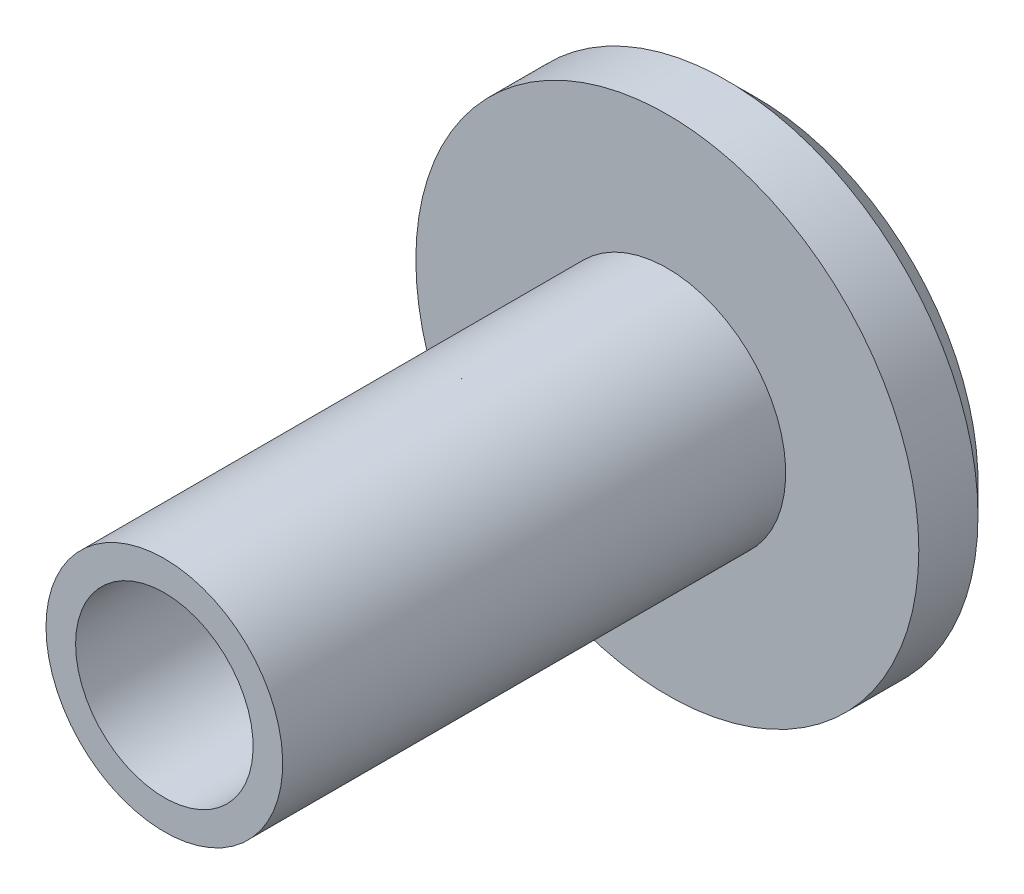
ISO-10303-21;
HEADER;
FILE_DESCRIPTION(('STEP AP214'),'2;1');
FILE_NAME('part.step','',(''),(''),'','','');
FILE_SCHEMA(('AUTOMOTIVE_DESIGN { 1 0 10303 214 1 1 1 1 }'));
ENDSEC;
DATA;
#1=APPLICATION_CONTEXT('core data for automotive mechanical design processes');
#2=APPLICATION_PROTOCOL_DEFINITION('international standard','automotive_design',2000,#1);
#3=PRODUCT_CONTEXT('',#1,'mechanical');
#4=PRODUCT('Part','Part','',(#3));
#5=PRODUCT_RELATED_PRODUCT_CATEGORY('part','',(#4));
#6=PRODUCT_DEFINITION_FORMATION('','',#4);
#7=PRODUCT_DEFINITION_CONTEXT('part definition',#1,'design');
#8=PRODUCT_DEFINITION('design','',#6,#7);
#9=PRODUCT_DEFINITION_SHAPE('','',#8);
#10=(LENGTH_UNIT() NAMED_UNIT(*) SI_UNIT(.MILLI.,.METRE.));
#11=(NAMED_UNIT(*) PLANE_ANGLE_UNIT() SI_UNIT($,.RADIAN.));
#12=(NAMED_UNIT(*) SI_UNIT($,.STERADIAN.) SOLID_ANGLE_UNIT());
#13=UNCERTAINTY_MEASURE_WITH_UNIT(LENGTH_MEASURE(1.E-05),#10,'distance_accuracy_value','');
#14=(GEOMETRIC_REPRESENTATION_CONTEXT(3) GLOBAL_UNCERTAINTY_ASSIGNED_CONTEXT((#13)) GLOBAL_UNIT_ASSIGNED_CONTEXT((#10,
#11,#12)) REPRESENTATION_CONTEXT('',''));
#15=CARTESIAN_POINT('',(0.,0.,0.));
#16=DIRECTION('',(0.,0.,1.));
#17=DIRECTION('',(1.,0.,0.));
#18=AXIS2_PLACEMENT_3D('',#15,#16,#17);
#19=CARTESIAN_POINT('',(172.530839914594,-193.837695743439,102.260489149574));
#20=DIRECTION('',(0.,0.,1.));
#21=DIRECTION('',(1.,0.,0.));
#22=AXIS2_PLACEMENT_3D('',#19,#20,#21);
#23=CONICAL_SURFACE('',#22,3.75,0.785398162499995);
#24=CARTESIAN_POINT('',(172.530839914594,-193.837695743439,102.260489149574));
#25=DIRECTION('',(0.,0.,-1.));
#26=DIRECTION('',(-1.,0.,0.));
#27=AXIS2_PLACEMENT_3D('',#24,#25,#26);
#28=CIRCLE('',#27,3.75);
#29=CARTESIAN_POINT('',(168.780839914594,-193.837695743439,102.260489149574));
#30=VERTEX_POINT('',#29);
#31=EDGE_CURVE('E216',#30,#30,#28,.T.);
#32=ORIENTED_EDGE('',*,*,#31,.F.);
#33=EDGE_LOOP('',(#32));
#34=FACE_BOUND('',#33,.T.);
#35=CARTESIAN_POINT('',(172.530839914594,-193.837695743439,102.760489149574));
#36=DIRECTION('',(0.,0.,1.));
#37=DIRECTION('',(-1.,0.,0.));
#38=AXIS2_PLACEMENT_3D('',#35,#36,#37);
#39=CIRCLE('',#38,4.25);
#40=CARTESIAN_POINT('',(168.280839914593,-193.837695743439,102.760489149574));
#41=VERTEX_POINT('',#40);
#42=EDGE_CURVE('E46',#41,#41,#39,.T.);
#43=ORIENTED_EDGE('',*,*,#42,.F.);
#44=EDGE_LOOP('',(#43));
#45=FACE_BOUND('',#44,.T.);
#46=ADVANCED_FACE('F42',(#34,#45),#23,.T.);
#47=CARTESIAN_POINT('',(172.530839914594,-193.837695743439,103.760489149574));
#48=DIRECTION('',(0.,0.,-1.));
#49=DIRECTION('',(-1.,0.,0.));
#50=AXIS2_PLACEMENT_3D('',#47,#48,#49);
#51=PLANE('',#50);
#52=CARTESIAN_POINT('',(172.530839914594,-193.837695743439,103.760489149574));
#53=DIRECTION('',(0.,0.,-1.));
#54=DIRECTION('',(0.,1.,0.));
#55=AXIS2_PLACEMENT_3D('',#52,#53,#54);
#56=CIRCLE('',#55,1.5);
#57=CARTESIAN_POINT('',(172.530839914594,-192.337695743439,103.760489149574));
#58=VERTEX_POINT('',#57);
#59=EDGE_CURVE('E107',#58,#58,#56,.T.);
#60=ORIENTED_EDGE('',*,*,#59,.F.);
#61=EDGE_LOOP('',(#60));
#62=FACE_BOUND('',#61,.T.);
#63=ADVANCED_FACE('F245',(#62),#51,.F.);
#64=CARTESIAN_POINT('',(172.530839914594,-193.837695743439,103.260489149574));
#65=DIRECTION('',(0.,0.,-1.));
#66=DIRECTION('',(-1.,0.,0.));
#67=AXIS2_PLACEMENT_3D('',#64,#65,#66);
#68=PLANE('',#67);
#69=DIRECTION('',(-0.866025403784439,-0.5,0.));
#70=VECTOR('',#69,1.);
#71=CARTESIAN_POINT('',(172.530839914594,-195.281071416414,103.260489149574));
#72=LINE('',#71,#70);
#73=CARTESIAN_POINT('',(173.780839914594,-194.559383579927,103.260489149574));
#74=VERTEX_POINT('',#73);
#75=CARTESIAN_POINT('',(172.530839914594,-195.281071416414,103.260489149574));
#76=VERTEX_POINT('',#75);
#77=EDGE_CURVE('E53',#74,#76,#72,.T.);
#78=ORIENTED_EDGE('',*,*,#77,.T.);
#79=DIRECTION('',(-0.866025403784438,0.5,0.));
#80=VECTOR('',#79,1.);
#81=CARTESIAN_POINT('',(171.280839914594,-194.559383579927,103.260489149574));
#82=LINE('',#81,#80);
#83=CARTESIAN_POINT('',(171.280839914594,-194.559383579927,103.260489149574));
#84=VERTEX_POINT('',#83);
#85=EDGE_CURVE('E11',#76,#84,#82,.T.);
#86=ORIENTED_EDGE('',*,*,#85,.T.);
#87=DIRECTION('',(0.,-1.,0.));
#88=VECTOR('',#87,1.);
#89=CARTESIAN_POINT('',(171.280839914594,-193.116007906952,103.260489149574));
#90=LINE('',#89,#88);
#91=CARTESIAN_POINT('',(171.280839914594,-193.116007906952,103.260489149574));
#92=VERTEX_POINT('',#91);
#93=EDGE_CURVE('E220',#92,#84,#90,.T.);
#94=ORIENTED_EDGE('',*,*,#93,.F.);
#95=DIRECTION('',(0.866025403784439,0.5,0.));
#96=VECTOR('',#95,1.);
#97=CARTESIAN_POINT('',(172.530839914594,-192.394320070465,103.260489149574));
#98=LINE('',#97,#96);
#99=CARTESIAN_POINT('',(172.530839914594,-192.394320070465,103.260489149574));
#100=VERTEX_POINT('',#99);
#101=EDGE_CURVE('E159',#92,#100,#98,.T.);
#102=ORIENTED_EDGE('',*,*,#101,.T.);
#103=DIRECTION('',(-0.866025403784439,0.5,0.));
#104=VECTOR('',#103,1.);
#105=CARTESIAN_POINT('',(173.780839914594,-193.116007906952,103.260489149574));
#106=LINE('',#105,#104);
#107=CARTESIAN_POINT('',(173.780839914594,-193.116007906952,103.260489149574));
#108=VERTEX_POINT('',#107);
#109=EDGE_CURVE('E156',#108,#100,#106,.T.);
#110=ORIENTED_EDGE('',*,*,#109,.F.);
#111=DIRECTION('',(0.,-1.,0.));
#112=VECTOR('',#111,1.);
#113=CARTESIAN_POINT('',(173.780839914594,-194.559383579927,103.260489149574));
#114=LINE('',#113,#112);
#115=EDGE_CURVE('E143',#108,#74,#114,.T.);
#116=ORIENTED_EDGE('',*,*,#115,.T.);
#117=EDGE_LOOP('',(#78,#86,#94,#102,#110,#116));
#118=FACE_BOUND('',#117,.T.);
#119=ADVANCED_FACE('F157',(#118),#68,.T.);
#120=CARTESIAN_POINT('',(171.280839914594,-194.559383579927,117.460489149574));
#121=DIRECTION('',(0.5,0.866025403784438,0.));
#122=DIRECTION('',(0.,0.,-1.));
#123=AXIS2_PLACEMENT_3D('',#120,#121,#122);
#124=PLANE('',#123);
#125=DIRECTION('',(0.,0.,1.));
#126=VECTOR('',#125,1.);
#127=CARTESIAN_POINT('',(171.280839914594,-194.559383579927,117.460489149574));
#128=LINE('',#127,#126);
#129=CARTESIAN_POINT('',(171.280839914594,-194.559383579927,102.260489149574));
#130=VERTEX_POINT('',#129);
#131=EDGE_CURVE('E178',#130,#84,#128,.T.);
#132=ORIENTED_EDGE('',*,*,#131,.T.);
#133=ORIENTED_EDGE('',*,*,#85,.F.);
#134=DIRECTION('',(0.,0.,1.));
#135=VECTOR('',#134,1.);
#136=CARTESIAN_POINT('',(172.530839914594,-195.281071416414,117.460489149574));
#137=LINE('',#136,#135);
#138=CARTESIAN_POINT('',(172.530839914594,-195.281071416414,102.260489149574));
#139=VERTEX_POINT('',#138);
#140=EDGE_CURVE('E153',#139,#76,#137,.T.);
#141=ORIENTED_EDGE('',*,*,#140,.F.);
#142=DIRECTION('',(0.866025403784438,-0.5,0.));
#143=VECTOR('',#142,1.);
#144=CARTESIAN_POINT('',(171.905839914593,-194.92022749817,102.260489149574));
#145=LINE('',#144,#143);
#146=EDGE_CURVE('E207',#130,#139,#145,.T.);
#147=ORIENTED_EDGE('',*,*,#146,.F.);
#148=EDGE_LOOP('',(#132,#133,#141,#147));
#149=FACE_BOUND('',#148,.T.);
#150=ADVANCED_FACE('F280',(#149),#124,.T.);
#151=CARTESIAN_POINT('',(172.530839914594,-195.281071416414,117.460489149574));
#152=DIRECTION('',(-0.5,0.866025403784439,0.));
#153=DIRECTION('',(0.,0.,1.));
#154=AXIS2_PLACEMENT_3D('',#151,#152,#153);
#155=PLANE('',#154);
#156=ORIENTED_EDGE('',*,*,#140,.T.);
#157=ORIENTED_EDGE('',*,*,#77,.F.);
#158=DIRECTION('',(0.,0.,1.));
#159=VECTOR('',#158,1.);
#160=CARTESIAN_POINT('',(173.780839914594,-194.559383579927,117.460489149574));
#161=LINE('',#160,#159);
#162=CARTESIAN_POINT('',(173.780839914594,-194.559383579927,102.260489149574));
#163=VERTEX_POINT('',#162);
#164=EDGE_CURVE('E150',#163,#74,#161,.T.);
#165=ORIENTED_EDGE('',*,*,#164,.F.);
#166=DIRECTION('',(0.866025403784439,0.5,0.));
#167=VECTOR('',#166,1.);
#168=CARTESIAN_POINT('',(173.155839914593,-194.92022749817,102.260489149574));
#169=LINE('',#168,#167);
#170=EDGE_CURVE('E211',#139,#163,#169,.T.);
#171=ORIENTED_EDGE('',*,*,#170,.F.);
#172=EDGE_LOOP('',(#156,#157,#165,#171));
#173=FACE_BOUND('',#172,.T.);
#174=ADVANCED_FACE('F44',(#173),#155,.T.);
#175=CARTESIAN_POINT('',(173.780839914594,-194.559383579927,117.460489149574));
#176=DIRECTION('',(-1.,0.,0.));
#177=DIRECTION('',(0.,0.,1.));
#178=AXIS2_PLACEMENT_3D('',#175,#176,#177);
#179=PLANE('',#178);
#180=ORIENTED_EDGE('',*,*,#164,.T.);
#181=ORIENTED_EDGE('',*,*,#115,.F.);
#182=DIRECTION('',(0.,0.,1.));
#183=VECTOR('',#182,1.);
#184=CARTESIAN_POINT('',(173.780839914594,-193.116007906952,117.460489149574));
#185=LINE('',#184,#183);
#186=CARTESIAN_POINT('',(173.780839914594,-193.116007906952,102.260489149574));
#187=VERTEX_POINT('',#186);
#188=EDGE_CURVE('E148',#187,#108,#185,.T.);
#189=ORIENTED_EDGE('',*,*,#188,.F.);
#190=DIRECTION('',(0.,1.,0.));
#191=VECTOR('',#190,1.);
#192=CARTESIAN_POINT('',(173.780839914594,-193.837695743439,102.260489149574));
#193=LINE('',#192,#191);
#194=EDGE_CURVE('E181',#163,#187,#193,.T.);
#195=ORIENTED_EDGE('',*,*,#194,.F.);
#196=EDGE_LOOP('',(#180,#181,#189,#195));
#197=FACE_BOUND('',#196,.T.);
#198=ADVANCED_FACE('F145',(#197),#179,.T.);
#199=CARTESIAN_POINT('',(173.780839914594,-193.116007906952,117.460489149574));
#200=DIRECTION('',(-0.5,-0.866025403784439,0.));
#201=DIRECTION('',(-0.866025403784439,0.5,0.));
#202=AXIS2_PLACEMENT_3D('',#199,#200,#201);
#203=PLANE('',#202);
#204=ORIENTED_EDGE('',*,*,#188,.T.);
#205=ORIENTED_EDGE('',*,*,#109,.T.);
#206=DIRECTION('',(0.,0.,1.));
#207=VECTOR('',#206,1.);
#208=CARTESIAN_POINT('',(172.530839914594,-192.394320070465,117.460489149574));
#209=LINE('',#208,#207);
#210=CARTESIAN_POINT('',(172.530839914594,-192.394320070465,102.260489149574));
#211=VERTEX_POINT('',#210);
#212=EDGE_CURVE('E174',#211,#100,#209,.T.);
#213=ORIENTED_EDGE('',*,*,#212,.F.);
#214=DIRECTION('',(-0.866025403784439,0.5,0.));
#215=VECTOR('',#214,1.);
#216=CARTESIAN_POINT('',(173.155839914593,-192.755163988709,102.260489149574));
#217=LINE('',#216,#215);
#218=EDGE_CURVE('E166',#187,#211,#217,.T.);
#219=ORIENTED_EDGE('',*,*,#218,.F.);
#220=EDGE_LOOP('',(#204,#205,#213,#219));
#221=FACE_BOUND('',#220,.T.);
#222=ADVANCED_FACE('F164',(#221),#203,.T.);
#223=CARTESIAN_POINT('',(172.530839914594,-192.394320070465,117.460489149574));
#224=DIRECTION('',(0.5,-0.866025403784439,0.));
#225=DIRECTION('',(0.,0.,-1.));
#226=AXIS2_PLACEMENT_3D('',#223,#224,#225);
#227=PLANE('',#226);
#228=ORIENTED_EDGE('',*,*,#212,.T.);
#229=ORIENTED_EDGE('',*,*,#101,.F.);
#230=DIRECTION('',(0.,0.,1.));
#231=VECTOR('',#230,1.);
#232=CARTESIAN_POINT('',(171.280839914594,-193.116007906952,117.460489149574));
#233=LINE('',#232,#231);
#234=CARTESIAN_POINT('',(171.280839914594,-193.116007906952,102.260489149574));
#235=VERTEX_POINT('',#234);
#236=EDGE_CURVE('E184',#235,#92,#233,.T.);
#237=ORIENTED_EDGE('',*,*,#236,.F.);
#238=DIRECTION('',(-0.866025403784439,-0.5,0.));
#239=VECTOR('',#238,1.);
#240=CARTESIAN_POINT('',(171.905839914593,-192.755163988709,102.260489149574));
#241=LINE('',#240,#239);
#242=EDGE_CURVE('E208',#211,#235,#241,.T.);
#243=ORIENTED_EDGE('',*,*,#242,.F.);
#244=EDGE_LOOP('',(#228,#229,#237,#243));
#245=FACE_BOUND('',#244,.T.);
#246=ADVANCED_FACE('F271',(#245),#227,.T.);
#247=CARTESIAN_POINT('',(171.280839914594,-193.116007906952,117.460489149574));
#248=DIRECTION('',(1.,0.,0.));
#249=DIRECTION('',(0.,1.,0.));
#250=AXIS2_PLACEMENT_3D('',#247,#248,#249);
#251=PLANE('',#250);
#252=ORIENTED_EDGE('',*,*,#236,.T.);
#253=ORIENTED_EDGE('',*,*,#93,.T.);
#254=ORIENTED_EDGE('',*,*,#131,.F.);
#255=DIRECTION('',(0.,-1.,0.));
#256=VECTOR('',#255,1.);
#257=CARTESIAN_POINT('',(171.280839914594,-193.837695743439,102.260489149574));
#258=LINE('',#257,#256);
#259=EDGE_CURVE('E204',#235,#130,#258,.T.);
#260=ORIENTED_EDGE('',*,*,#259,.F.);
#261=EDGE_LOOP('',(#252,#253,#254,#260));
#262=FACE_BOUND('',#261,.T.);
#263=ADVANCED_FACE('F266',(#262),#251,.T.);
#264=CARTESIAN_POINT('',(172.530839914594,-193.837695743439,103.760489149574));
#265=DIRECTION('',(0.,0.,-1.));
#266=DIRECTION('',(-1.,0.,0.));
#267=AXIS2_PLACEMENT_3D('',#264,#265,#266);
#268=PLANE('',#267);
#269=CARTESIAN_POINT('',(172.530839914594,-193.837695743439,103.760489149574));
#270=DIRECTION('',(0.,0.,-1.));
#271=DIRECTION('',(-1.,0.,0.));
#272=AXIS2_PLACEMENT_3D('',#269,#270,#271);
#273=CIRCLE('',#272,4.25);
#274=CARTESIAN_POINT('',(168.280839914593,-193.837695743439,103.760489149574));
#275=VERTEX_POINT('',#274);
#276=EDGE_CURVE('E122',#275,#275,#273,.T.);
#277=ORIENTED_EDGE('',*,*,#276,.F.);
#278=EDGE_LOOP('',(#277));
#279=FACE_BOUND('',#278,.T.);
#280=CARTESIAN_POINT('',(172.530839914594,-193.837695743439,103.760489149574));
#281=DIRECTION('',(0.,0.,1.));
#282=DIRECTION('',(-1.,0.,0.));
#283=AXIS2_PLACEMENT_3D('',#280,#281,#282);
#284=CIRCLE('',#283,2.);
#285=CARTESIAN_POINT('',(170.530839914594,-193.837695743439,103.760489149574));
#286=VERTEX_POINT('',#285);
#287=EDGE_CURVE('E185',#286,#286,#284,.T.);
#288=ORIENTED_EDGE('',*,*,#287,.F.);
#289=EDGE_LOOP('',(#288));
#290=FACE_BOUND('',#289,.T.);
#291=ADVANCED_FACE('F270',(#279,#290),#268,.F.);
#292=CARTESIAN_POINT('',(172.530839914594,-193.837695743439,103.760489149574));
#293=DIRECTION('',(0.,0.,-1.));
#294=DIRECTION('',(-1.,0.,0.));
#295=AXIS2_PLACEMENT_3D('',#292,#293,#294);
#296=CYLINDRICAL_SURFACE('',#295,4.25);
#297=ORIENTED_EDGE('',*,*,#276,.T.);
#298=EDGE_LOOP('',(#297));
#299=FACE_BOUND('',#298,.T.);
#300=ORIENTED_EDGE('',*,*,#42,.T.);
#301=EDGE_LOOP('',(#300));
#302=FACE_BOUND('',#301,.T.);
#303=ADVANCED_FACE('F327',(#299,#302),#296,.T.);
#304=CARTESIAN_POINT('',(172.530839914594,-193.837695743439,104.260489149574));
#305=DIRECTION('',(0.,0.,1.));
#306=DIRECTION('',(1.,0.,0.));
#307=AXIS2_PLACEMENT_3D('',#304,#305,#306);
#308=CYLINDRICAL_SURFACE('',#307,1.5);
#309=ORIENTED_EDGE('',*,*,#59,.T.);
#310=EDGE_LOOP('',(#309));
#311=FACE_BOUND('',#310,.T.);
#312=CARTESIAN_POINT('',(172.530839914594,-193.837695743439,112.260489149574));
#313=DIRECTION('',(0.,0.,1.));
#314=DIRECTION('',(-1.,0.,0.));
#315=AXIS2_PLACEMENT_3D('',#312,#313,#314);
#316=CIRCLE('',#315,1.5);
#317=CARTESIAN_POINT('',(171.030839914594,-193.837695743439,112.260489149574));
#318=VERTEX_POINT('',#317);
#319=EDGE_CURVE('E188',#318,#318,#316,.T.);
#320=ORIENTED_EDGE('',*,*,#319,.T.);
#321=EDGE_LOOP('',(#320));
#322=FACE_BOUND('',#321,.T.);
#323=ADVANCED_FACE('F295',(#311,#322),#308,.F.);
#324=CARTESIAN_POINT('',(172.530839914594,-193.837695743439,112.260489149574));
#325=DIRECTION('',(0.,0.,-1.));
#326=DIRECTION('',(-1.,0.,0.));
#327=AXIS2_PLACEMENT_3D('',#324,#325,#326);
#328=PLANE('',#327);
#329=CARTESIAN_POINT('',(172.530839914594,-193.837695743439,112.260489149574));
#330=DIRECTION('',(0.,0.,-1.));
#331=DIRECTION('',(0.,1.,0.));
#332=AXIS2_PLACEMENT_3D('',#329,#330,#331);
#333=CIRCLE('',#332,2.);
#334=CARTESIAN_POINT('',(172.530839914594,-191.837695743439,112.260489149574));
#335=VERTEX_POINT('',#334);
#336=EDGE_CURVE('E180',#335,#335,#333,.T.);
#337=ORIENTED_EDGE('',*,*,#336,.F.);
#338=EDGE_LOOP('',(#337));
#339=FACE_BOUND('',#338,.T.);
#340=ORIENTED_EDGE('',*,*,#319,.F.);
#341=EDGE_LOOP('',(#340));
#342=FACE_BOUND('',#341,.T.);
#343=ADVANCED_FACE('F261',(#339,#342),#328,.F.);
#344=CARTESIAN_POINT('',(172.530839914594,-193.837695743439,112.260489149574));
#345=DIRECTION('',(0.,0.,-1.));
#346=DIRECTION('',(-1.,0.,0.));
#347=AXIS2_PLACEMENT_3D('',#344,#345,#346);
#348=CYLINDRICAL_SURFACE('',#347,2.);
#349=ORIENTED_EDGE('',*,*,#287,.T.);
#350=EDGE_LOOP('',(#349));
#351=FACE_BOUND('',#350,.T.);
#352=ORIENTED_EDGE('',*,*,#336,.T.);
#353=EDGE_LOOP('',(#352));
#354=FACE_BOUND('',#353,.T.);
#355=ADVANCED_FACE('F257',(#351,#354),#348,.T.);
#356=CARTESIAN_POINT('',(172.530839914594,-193.837695743439,102.260489149574));
#357=DIRECTION('',(0.,0.,-1.));
#358=DIRECTION('',(-1.,0.,0.));
#359=AXIS2_PLACEMENT_3D('',#356,#357,#358);
#360=PLANE('',#359);
#361=ORIENTED_EDGE('',*,*,#242,.T.);
#362=ORIENTED_EDGE('',*,*,#259,.T.);
#363=ORIENTED_EDGE('',*,*,#146,.T.);
#364=ORIENTED_EDGE('',*,*,#170,.T.);
#365=ORIENTED_EDGE('',*,*,#194,.T.);
#366=ORIENTED_EDGE('',*,*,#218,.T.);
#367=EDGE_LOOP('',(#361,#362,#363,#364,#365,#366));
#368=FACE_BOUND('',#367,.T.);
#369=ORIENTED_EDGE('',*,*,#31,.T.);
#370=EDGE_LOOP('',(#369));
#371=FACE_BOUND('',#370,.T.);
#372=ADVANCED_FACE('F241',(#368,#371),#360,.T.);
#373=CLOSED_SHELL('',(#46,#63,#119,#150,#174,#198,#222,#246,#263,#291,#303,#323,#343,#355,#372));
#374=MANIFOLD_SOLID_BREP('B2',#373);
#375=ADVANCED_BREP_SHAPE_REPRESENTATION('',(#18,#374),#14);
#376=SHAPE_DEFINITION_REPRESENTATION(#9,#375);
ENDSEC;
END-ISO-10303-21;
